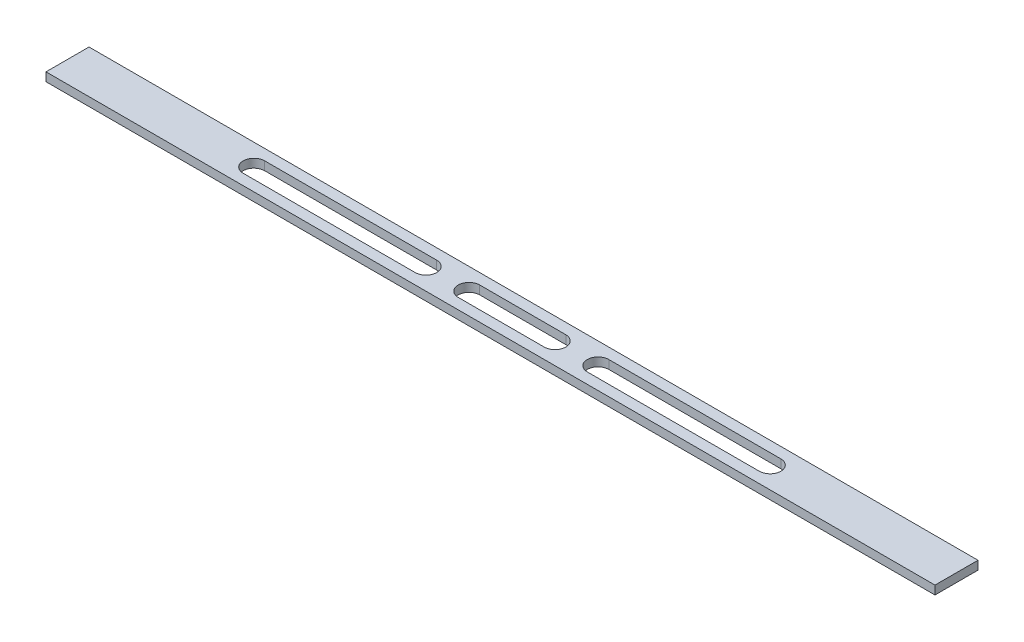
ISO-10303-21;
HEADER;
FILE_DESCRIPTION(('STEP AP214'),'2;1');
FILE_NAME('part.step','',(''),(''),'','','');
FILE_SCHEMA(('AUTOMOTIVE_DESIGN { 1 0 10303 214 1 1 1 1 }'));
ENDSEC;
DATA;
#1=APPLICATION_CONTEXT('core data for automotive mechanical design processes');
#2=APPLICATION_PROTOCOL_DEFINITION('international standard','automotive_design',2000,#1);
#3=PRODUCT_CONTEXT('',#1,'mechanical');
#4=PRODUCT('Part','Part','',(#3));
#5=PRODUCT_RELATED_PRODUCT_CATEGORY('part','',(#4));
#6=PRODUCT_DEFINITION_FORMATION('','',#4);
#7=PRODUCT_DEFINITION_CONTEXT('part definition',#1,'design');
#8=PRODUCT_DEFINITION('design','',#6,#7);
#9=PRODUCT_DEFINITION_SHAPE('','',#8);
#10=(LENGTH_UNIT() NAMED_UNIT(*) SI_UNIT(.MILLI.,.METRE.));
#11=(NAMED_UNIT(*) PLANE_ANGLE_UNIT() SI_UNIT($,.RADIAN.));
#12=(NAMED_UNIT(*) SI_UNIT($,.STERADIAN.) SOLID_ANGLE_UNIT());
#13=UNCERTAINTY_MEASURE_WITH_UNIT(LENGTH_MEASURE(1.E-05),#10,'distance_accuracy_value','');
#14=(GEOMETRIC_REPRESENTATION_CONTEXT(3) GLOBAL_UNCERTAINTY_ASSIGNED_CONTEXT((#13)) GLOBAL_UNIT_ASSIGNED_CONTEXT((#10,
#11,#12)) REPRESENTATION_CONTEXT('',''));
#15=CARTESIAN_POINT('',(0.,0.,0.));
#16=DIRECTION('',(0.,0.,1.));
#17=DIRECTION('',(1.,0.,0.));
#18=AXIS2_PLACEMENT_3D('',#15,#16,#17);
#19=CARTESIAN_POINT('',(-310.,6.,-15.));
#20=DIRECTION('',(1.,0.,0.));
#21=DIRECTION('',(0.,0.,-1.));
#22=AXIS2_PLACEMENT_3D('',#19,#20,#21);
#23=PLANE('',#22);
#24=DIRECTION('',(0.,0.,1.));
#25=VECTOR('',#24,1.);
#26=CARTESIAN_POINT('',(-310.,0.,-15.));
#27=LINE('',#26,#25);
#28=CARTESIAN_POINT('',(-310.,0.,-15.));
#29=VERTEX_POINT('',#28);
#30=CARTESIAN_POINT('',(-310.,0.,15.));
#31=VERTEX_POINT('',#30);
#32=EDGE_CURVE('E241',#29,#31,#27,.T.);
#33=ORIENTED_EDGE('',*,*,#32,.T.);
#34=DIRECTION('',(0.,-1.,0.));
#35=VECTOR('',#34,1.);
#36=CARTESIAN_POINT('',(-310.,6.,15.));
#37=LINE('',#36,#35);
#38=CARTESIAN_POINT('',(-310.,6.,15.));
#39=VERTEX_POINT('',#38);
#40=EDGE_CURVE('E11',#39,#31,#37,.T.);
#41=ORIENTED_EDGE('',*,*,#40,.F.);
#42=DIRECTION('',(0.,0.,1.));
#43=VECTOR('',#42,1.);
#44=CARTESIAN_POINT('',(-310.,6.,-15.));
#45=LINE('',#44,#43);
#46=CARTESIAN_POINT('',(-310.,6.,-15.));
#47=VERTEX_POINT('',#46);
#48=EDGE_CURVE('E248',#47,#39,#45,.T.);
#49=ORIENTED_EDGE('',*,*,#48,.F.);
#50=DIRECTION('',(0.,-1.,0.));
#51=VECTOR('',#50,1.);
#52=CARTESIAN_POINT('',(-310.,6.,-15.));
#53=LINE('',#52,#51);
#54=EDGE_CURVE('E258',#47,#29,#53,.T.);
#55=ORIENTED_EDGE('',*,*,#54,.T.);
#56=EDGE_LOOP('',(#33,#41,#49,#55));
#57=FACE_BOUND('',#56,.T.);
#58=ADVANCED_FACE('F34',(#57),#23,.F.);
#59=CARTESIAN_POINT('',(-310.,6.,15.));
#60=DIRECTION('',(0.,0.,-1.));
#61=DIRECTION('',(-1.,0.,0.));
#62=AXIS2_PLACEMENT_3D('',#59,#60,#61);
#63=PLANE('',#62);
#64=DIRECTION('',(1.,0.,0.));
#65=VECTOR('',#64,1.);
#66=CARTESIAN_POINT('',(-310.,0.,15.));
#67=LINE('',#66,#65);
#68=CARTESIAN_POINT('',(310.,0.,15.));
#69=VERTEX_POINT('',#68);
#70=EDGE_CURVE('E261',#31,#69,#67,.T.);
#71=ORIENTED_EDGE('',*,*,#70,.T.);
#72=DIRECTION('',(0.,-1.,0.));
#73=VECTOR('',#72,1.);
#74=CARTESIAN_POINT('',(310.,6.,15.));
#75=LINE('',#74,#73);
#76=CARTESIAN_POINT('',(310.,6.,15.));
#77=VERTEX_POINT('',#76);
#78=EDGE_CURVE('E41',#77,#69,#75,.T.);
#79=ORIENTED_EDGE('',*,*,#78,.F.);
#80=DIRECTION('',(1.,0.,0.));
#81=VECTOR('',#80,1.);
#82=CARTESIAN_POINT('',(-310.,6.,15.));
#83=LINE('',#82,#81);
#84=EDGE_CURVE('E251',#39,#77,#83,.T.);
#85=ORIENTED_EDGE('',*,*,#84,.F.);
#86=ORIENTED_EDGE('',*,*,#40,.T.);
#87=EDGE_LOOP('',(#71,#79,#85,#86));
#88=FACE_BOUND('',#87,.T.);
#89=ADVANCED_FACE('F290',(#88),#63,.F.);
#90=CARTESIAN_POINT('',(310.,6.,-15.));
#91=DIRECTION('',(-1.,0.,0.));
#92=DIRECTION('',(0.,0.,1.));
#93=AXIS2_PLACEMENT_3D('',#90,#91,#92);
#94=PLANE('',#93);
#95=DIRECTION('',(0.,0.,-1.));
#96=VECTOR('',#95,1.);
#97=CARTESIAN_POINT('',(310.,0.,-15.));
#98=LINE('',#97,#96);
#99=CARTESIAN_POINT('',(310.,0.,-15.));
#100=VERTEX_POINT('',#99);
#101=EDGE_CURVE('E263',#69,#100,#98,.T.);
#102=ORIENTED_EDGE('',*,*,#101,.T.);
#103=DIRECTION('',(0.,-1.,0.));
#104=VECTOR('',#103,1.);
#105=CARTESIAN_POINT('',(310.,6.,-15.));
#106=LINE('',#105,#104);
#107=CARTESIAN_POINT('',(310.,6.,-15.));
#108=VERTEX_POINT('',#107);
#109=EDGE_CURVE('E268',#108,#100,#106,.T.);
#110=ORIENTED_EDGE('',*,*,#109,.F.);
#111=DIRECTION('',(0.,0.,-1.));
#112=VECTOR('',#111,1.);
#113=CARTESIAN_POINT('',(310.,6.,-15.));
#114=LINE('',#113,#112);
#115=EDGE_CURVE('E254',#77,#108,#114,.T.);
#116=ORIENTED_EDGE('',*,*,#115,.F.);
#117=ORIENTED_EDGE('',*,*,#78,.T.);
#118=EDGE_LOOP('',(#102,#110,#116,#117));
#119=FACE_BOUND('',#118,.T.);
#120=ADVANCED_FACE('F275',(#119),#94,.F.);
#121=CARTESIAN_POINT('',(-310.,6.,-15.));
#122=DIRECTION('',(0.,0.,1.));
#123=DIRECTION('',(1.,0.,0.));
#124=AXIS2_PLACEMENT_3D('',#121,#122,#123);
#125=PLANE('',#124);
#126=DIRECTION('',(-1.,0.,0.));
#127=VECTOR('',#126,1.);
#128=CARTESIAN_POINT('',(-310.,0.,-15.));
#129=LINE('',#128,#127);
#130=EDGE_CURVE('E252',#100,#29,#129,.T.);
#131=ORIENTED_EDGE('',*,*,#130,.T.);
#132=ORIENTED_EDGE('',*,*,#54,.F.);
#133=DIRECTION('',(-1.,0.,0.));
#134=VECTOR('',#133,1.);
#135=CARTESIAN_POINT('',(-310.,6.,-15.));
#136=LINE('',#135,#134);
#137=EDGE_CURVE('E256',#108,#47,#136,.T.);
#138=ORIENTED_EDGE('',*,*,#137,.F.);
#139=ORIENTED_EDGE('',*,*,#109,.T.);
#140=EDGE_LOOP('',(#131,#132,#138,#139));
#141=FACE_BOUND('',#140,.T.);
#142=ADVANCED_FACE('F283',(#141),#125,.F.);
#143=CARTESIAN_POINT('',(0.,6.,0.));
#144=DIRECTION('',(0.,1.,0.));
#145=DIRECTION('',(0.,0.,1.));
#146=AXIS2_PLACEMENT_3D('',#143,#144,#145);
#147=PLANE('',#146);
#148=CARTESIAN_POINT('',(60.,6.,0.));
#149=DIRECTION('',(0.,1.,0.));
#150=DIRECTION('',(0.,0.,1.));
#151=AXIS2_PLACEMENT_3D('',#148,#149,#150);
#152=CIRCLE('',#151,7.5);
#153=CARTESIAN_POINT('',(60.,6.,-7.5));
#154=VERTEX_POINT('',#153);
#155=CARTESIAN_POINT('',(60.,6.,7.5));
#156=VERTEX_POINT('',#155);
#157=EDGE_CURVE('E48',#154,#156,#152,.T.);
#158=ORIENTED_EDGE('',*,*,#157,.F.);
#159=DIRECTION('',(-1.,0.,0.));
#160=VECTOR('',#159,1.);
#161=CARTESIAN_POINT('',(60.,6.,-7.5));
#162=LINE('',#161,#160);
#163=CARTESIAN_POINT('',(180.,6.,-7.5));
#164=VERTEX_POINT('',#163);
#165=EDGE_CURVE('E191',#164,#154,#162,.T.);
#166=ORIENTED_EDGE('',*,*,#165,.F.);
#167=CARTESIAN_POINT('',(180.,6.,0.));
#168=DIRECTION('',(0.,1.,0.));
#169=DIRECTION('',(0.,0.,1.));
#170=AXIS2_PLACEMENT_3D('',#167,#168,#169);
#171=CIRCLE('',#170,7.5);
#172=CARTESIAN_POINT('',(180.,6.,7.5));
#173=VERTEX_POINT('',#172);
#174=EDGE_CURVE('E205',#173,#164,#171,.T.);
#175=ORIENTED_EDGE('',*,*,#174,.F.);
#176=DIRECTION('',(1.,0.,0.));
#177=VECTOR('',#176,1.);
#178=CARTESIAN_POINT('',(60.,6.,7.5));
#179=LINE('',#178,#177);
#180=EDGE_CURVE('E202',#156,#173,#179,.T.);
#181=ORIENTED_EDGE('',*,*,#180,.F.);
#182=EDGE_LOOP('',(#158,#166,#175,#181));
#183=FACE_BOUND('',#182,.T.);
#184=CARTESIAN_POINT('',(-60.,6.,0.));
#185=DIRECTION('',(0.,1.,0.));
#186=DIRECTION('',(0.,0.,1.));
#187=AXIS2_PLACEMENT_3D('',#184,#185,#186);
#188=CIRCLE('',#187,7.5);
#189=CARTESIAN_POINT('',(-60.,6.,7.50000000000001));
#190=VERTEX_POINT('',#189);
#191=CARTESIAN_POINT('',(-60.,6.,-7.49999999999999));
#192=VERTEX_POINT('',#191);
#193=EDGE_CURVE('E56',#190,#192,#188,.T.);
#194=ORIENTED_EDGE('',*,*,#193,.F.);
#195=DIRECTION('',(1.,0.,0.));
#196=VECTOR('',#195,1.);
#197=CARTESIAN_POINT('',(-60.,6.,7.50000000000001));
#198=LINE('',#197,#196);
#199=CARTESIAN_POINT('',(-180.,6.,7.50000000000003));
#200=VERTEX_POINT('',#199);
#201=EDGE_CURVE('E167',#200,#190,#198,.T.);
#202=ORIENTED_EDGE('',*,*,#201,.F.);
#203=CARTESIAN_POINT('',(-180.,6.,0.));
#204=DIRECTION('',(0.,1.,0.));
#205=DIRECTION('',(0.,0.,1.));
#206=AXIS2_PLACEMENT_3D('',#203,#204,#205);
#207=CIRCLE('',#206,7.5);
#208=CARTESIAN_POINT('',(-180.,6.,-7.49999999999997));
#209=VERTEX_POINT('',#208);
#210=EDGE_CURVE('E170',#209,#200,#207,.T.);
#211=ORIENTED_EDGE('',*,*,#210,.F.);
#212=DIRECTION('',(-1.,0.,0.));
#213=VECTOR('',#212,1.);
#214=CARTESIAN_POINT('',(-60.,6.,-7.49999999999999));
#215=LINE('',#214,#213);
#216=EDGE_CURVE('E176',#192,#209,#215,.T.);
#217=ORIENTED_EDGE('',*,*,#216,.F.);
#218=EDGE_LOOP('',(#194,#202,#211,#217));
#219=FACE_BOUND('',#218,.T.);
#220=CARTESIAN_POINT('',(30.,6.,0.));
#221=DIRECTION('',(0.,1.,0.));
#222=DIRECTION('',(0.,0.,1.));
#223=AXIS2_PLACEMENT_3D('',#220,#221,#222);
#224=CIRCLE('',#223,7.5);
#225=CARTESIAN_POINT('',(30.,6.,7.50000000000001));
#226=VERTEX_POINT('',#225);
#227=CARTESIAN_POINT('',(30.,6.,-7.49999999999999));
#228=VERTEX_POINT('',#227);
#229=EDGE_CURVE('E183',#226,#228,#224,.T.);
#230=ORIENTED_EDGE('',*,*,#229,.F.);
#231=DIRECTION('',(1.,0.,0.));
#232=VECTOR('',#231,1.);
#233=CARTESIAN_POINT('',(30.,6.,7.50000000000001));
#234=LINE('',#233,#232);
#235=CARTESIAN_POINT('',(-30.,6.,7.50000000000001));
#236=VERTEX_POINT('',#235);
#237=EDGE_CURVE('E220',#236,#226,#234,.T.);
#238=ORIENTED_EDGE('',*,*,#237,.F.);
#239=CARTESIAN_POINT('',(-30.,6.,0.));
#240=DIRECTION('',(0.,1.,0.));
#241=DIRECTION('',(0.,0.,1.));
#242=AXIS2_PLACEMENT_3D('',#239,#240,#241);
#243=CIRCLE('',#242,7.5);
#244=CARTESIAN_POINT('',(-30.,6.,-7.49999999999999));
#245=VERTEX_POINT('',#244);
#246=EDGE_CURVE('E234',#245,#236,#243,.T.);
#247=ORIENTED_EDGE('',*,*,#246,.F.);
#248=DIRECTION('',(-1.,0.,0.));
#249=VECTOR('',#248,1.);
#250=CARTESIAN_POINT('',(30.,6.,-7.49999999999999));
#251=LINE('',#250,#249);
#252=EDGE_CURVE('E231',#228,#245,#251,.T.);
#253=ORIENTED_EDGE('',*,*,#252,.F.);
#254=EDGE_LOOP('',(#230,#238,#247,#253));
#255=FACE_BOUND('',#254,.T.);
#256=ORIENTED_EDGE('',*,*,#48,.T.);
#257=ORIENTED_EDGE('',*,*,#84,.T.);
#258=ORIENTED_EDGE('',*,*,#115,.T.);
#259=ORIENTED_EDGE('',*,*,#137,.T.);
#260=EDGE_LOOP('',(#256,#257,#258,#259));
#261=FACE_BOUND('',#260,.T.);
#262=ADVANCED_FACE('F289',(#183,#219,#255,#261),#147,.T.);
#263=CARTESIAN_POINT('',(0.,0.,0.));
#264=DIRECTION('',(0.,1.,0.));
#265=DIRECTION('',(0.,0.,1.));
#266=AXIS2_PLACEMENT_3D('',#263,#264,#265);
#267=PLANE('',#266);
#268=DIRECTION('',(-1.,0.,0.));
#269=VECTOR('',#268,1.);
#270=CARTESIAN_POINT('',(60.,0.,-7.5));
#271=LINE('',#270,#269);
#272=CARTESIAN_POINT('',(180.,0.,-7.5));
#273=VERTEX_POINT('',#272);
#274=CARTESIAN_POINT('',(60.,0.,-7.5));
#275=VERTEX_POINT('',#274);
#276=EDGE_CURVE('E197',#273,#275,#271,.T.);
#277=ORIENTED_EDGE('',*,*,#276,.T.);
#278=CARTESIAN_POINT('',(60.,0.,0.));
#279=DIRECTION('',(0.,1.,0.));
#280=DIRECTION('',(0.,0.,1.));
#281=AXIS2_PLACEMENT_3D('',#278,#279,#280);
#282=CIRCLE('',#281,7.5);
#283=CARTESIAN_POINT('',(60.,0.,7.5));
#284=VERTEX_POINT('',#283);
#285=EDGE_CURVE('E187',#275,#284,#282,.T.);
#286=ORIENTED_EDGE('',*,*,#285,.T.);
#287=DIRECTION('',(1.,0.,0.));
#288=VECTOR('',#287,1.);
#289=CARTESIAN_POINT('',(60.,0.,7.5));
#290=LINE('',#289,#288);
#291=CARTESIAN_POINT('',(180.,0.,7.5));
#292=VERTEX_POINT('',#291);
#293=EDGE_CURVE('E190',#284,#292,#290,.T.);
#294=ORIENTED_EDGE('',*,*,#293,.T.);
#295=CARTESIAN_POINT('',(180.,0.,0.));
#296=DIRECTION('',(0.,1.,0.));
#297=DIRECTION('',(0.,0.,1.));
#298=AXIS2_PLACEMENT_3D('',#295,#296,#297);
#299=CIRCLE('',#298,7.5);
#300=EDGE_CURVE('E194',#292,#273,#299,.T.);
#301=ORIENTED_EDGE('',*,*,#300,.T.);
#302=EDGE_LOOP('',(#277,#286,#294,#301));
#303=FACE_BOUND('',#302,.T.);
#304=DIRECTION('',(1.,0.,0.));
#305=VECTOR('',#304,1.);
#306=CARTESIAN_POINT('',(-60.,0.,7.50000000000001));
#307=LINE('',#306,#305);
#308=CARTESIAN_POINT('',(-180.,0.,7.50000000000003));
#309=VERTEX_POINT('',#308);
#310=CARTESIAN_POINT('',(-60.,0.,7.50000000000001));
#311=VERTEX_POINT('',#310);
#312=EDGE_CURVE('E154',#309,#311,#307,.T.);
#313=ORIENTED_EDGE('',*,*,#312,.T.);
#314=CARTESIAN_POINT('',(-60.,0.,0.));
#315=DIRECTION('',(0.,1.,0.));
#316=DIRECTION('',(0.,0.,1.));
#317=AXIS2_PLACEMENT_3D('',#314,#315,#316);
#318=CIRCLE('',#317,7.5);
#319=CARTESIAN_POINT('',(-60.,0.,-7.49999999999999));
#320=VERTEX_POINT('',#319);
#321=EDGE_CURVE('E148',#311,#320,#318,.T.);
#322=ORIENTED_EDGE('',*,*,#321,.T.);
#323=DIRECTION('',(-1.,0.,0.));
#324=VECTOR('',#323,1.);
#325=CARTESIAN_POINT('',(-60.,0.,-7.49999999999999));
#326=LINE('',#325,#324);
#327=CARTESIAN_POINT('',(-180.,0.,-7.49999999999997));
#328=VERTEX_POINT('',#327);
#329=EDGE_CURVE('E158',#320,#328,#326,.T.);
#330=ORIENTED_EDGE('',*,*,#329,.T.);
#331=CARTESIAN_POINT('',(-180.,0.,0.));
#332=DIRECTION('',(0.,1.,0.));
#333=DIRECTION('',(0.,0.,1.));
#334=AXIS2_PLACEMENT_3D('',#331,#332,#333);
#335=CIRCLE('',#334,7.5);
#336=EDGE_CURVE('E162',#328,#309,#335,.T.);
#337=ORIENTED_EDGE('',*,*,#336,.T.);
#338=EDGE_LOOP('',(#313,#322,#330,#337));
#339=FACE_BOUND('',#338,.T.);
#340=DIRECTION('',(1.,0.,0.));
#341=VECTOR('',#340,1.);
#342=CARTESIAN_POINT('',(30.,0.,7.50000000000001));
#343=LINE('',#342,#341);
#344=CARTESIAN_POINT('',(-30.,0.,7.50000000000001));
#345=VERTEX_POINT('',#344);
#346=CARTESIAN_POINT('',(30.,0.,7.50000000000001));
#347=VERTEX_POINT('',#346);
#348=EDGE_CURVE('E226',#345,#347,#343,.T.);
#349=ORIENTED_EDGE('',*,*,#348,.T.);
#350=CARTESIAN_POINT('',(30.,0.,0.));
#351=DIRECTION('',(0.,1.,0.));
#352=DIRECTION('',(0.,0.,1.));
#353=AXIS2_PLACEMENT_3D('',#350,#351,#352);
#354=CIRCLE('',#353,7.5);
#355=CARTESIAN_POINT('',(30.,0.,-7.49999999999999));
#356=VERTEX_POINT('',#355);
#357=EDGE_CURVE('E216',#347,#356,#354,.T.);
#358=ORIENTED_EDGE('',*,*,#357,.T.);
#359=DIRECTION('',(-1.,0.,0.));
#360=VECTOR('',#359,1.);
#361=CARTESIAN_POINT('',(30.,0.,-7.49999999999999));
#362=LINE('',#361,#360);
#363=CARTESIAN_POINT('',(-30.,0.,-7.49999999999999));
#364=VERTEX_POINT('',#363);
#365=EDGE_CURVE('E219',#356,#364,#362,.T.);
#366=ORIENTED_EDGE('',*,*,#365,.T.);
#367=CARTESIAN_POINT('',(-30.,0.,0.));
#368=DIRECTION('',(0.,1.,0.));
#369=DIRECTION('',(0.,0.,1.));
#370=AXIS2_PLACEMENT_3D('',#367,#368,#369);
#371=CIRCLE('',#370,7.5);
#372=EDGE_CURVE('E223',#364,#345,#371,.T.);
#373=ORIENTED_EDGE('',*,*,#372,.T.);
#374=EDGE_LOOP('',(#349,#358,#366,#373));
#375=FACE_BOUND('',#374,.T.);
#376=ORIENTED_EDGE('',*,*,#32,.F.);
#377=ORIENTED_EDGE('',*,*,#130,.F.);
#378=ORIENTED_EDGE('',*,*,#101,.F.);
#379=ORIENTED_EDGE('',*,*,#70,.F.);
#380=EDGE_LOOP('',(#376,#377,#378,#379));
#381=FACE_BOUND('',#380,.T.);
#382=ADVANCED_FACE('F164',(#303,#339,#375,#381),#267,.F.);
#383=CARTESIAN_POINT('',(30.,0.,0.));
#384=DIRECTION('',(0.,1.,0.));
#385=DIRECTION('',(0.,0.,1.));
#386=AXIS2_PLACEMENT_3D('',#383,#384,#385);
#387=CYLINDRICAL_SURFACE('',#386,7.5);
#388=ORIENTED_EDGE('',*,*,#229,.T.);
#389=DIRECTION('',(0.,1.,0.));
#390=VECTOR('',#389,1.);
#391=CARTESIAN_POINT('',(30.,0.,-7.49999999999999));
#392=LINE('',#391,#390);
#393=EDGE_CURVE('E229',#356,#228,#392,.T.);
#394=ORIENTED_EDGE('',*,*,#393,.F.);
#395=ORIENTED_EDGE('',*,*,#357,.F.);
#396=DIRECTION('',(0.,1.,0.));
#397=VECTOR('',#396,1.);
#398=CARTESIAN_POINT('',(30.,0.,7.50000000000001));
#399=LINE('',#398,#397);
#400=EDGE_CURVE('E239',#347,#226,#399,.T.);
#401=ORIENTED_EDGE('',*,*,#400,.T.);
#402=EDGE_LOOP('',(#388,#394,#395,#401));
#403=FACE_BOUND('',#402,.T.);
#404=ADVANCED_FACE('F302',(#403),#387,.F.);
#405=CARTESIAN_POINT('',(30.,0.,7.50000000000001));
#406=DIRECTION('',(0.,0.,1.));
#407=DIRECTION('',(1.,0.,0.));
#408=AXIS2_PLACEMENT_3D('',#405,#406,#407);
#409=PLANE('',#408);
#410=ORIENTED_EDGE('',*,*,#237,.T.);
#411=ORIENTED_EDGE('',*,*,#400,.F.);
#412=ORIENTED_EDGE('',*,*,#348,.F.);
#413=DIRECTION('',(0.,1.,0.));
#414=VECTOR('',#413,1.);
#415=CARTESIAN_POINT('',(-30.,0.,7.50000000000001));
#416=LINE('',#415,#414);
#417=EDGE_CURVE('E242',#345,#236,#416,.T.);
#418=ORIENTED_EDGE('',*,*,#417,.T.);
#419=EDGE_LOOP('',(#410,#411,#412,#418));
#420=FACE_BOUND('',#419,.T.);
#421=ADVANCED_FACE('F309',(#420),#409,.F.);
#422=CARTESIAN_POINT('',(-30.,0.,0.));
#423=DIRECTION('',(0.,1.,0.));
#424=DIRECTION('',(0.,0.,1.));
#425=AXIS2_PLACEMENT_3D('',#422,#423,#424);
#426=CYLINDRICAL_SURFACE('',#425,7.5);
#427=ORIENTED_EDGE('',*,*,#246,.T.);
#428=ORIENTED_EDGE('',*,*,#417,.F.);
#429=ORIENTED_EDGE('',*,*,#372,.F.);
#430=DIRECTION('',(0.,1.,0.));
#431=VECTOR('',#430,1.);
#432=CARTESIAN_POINT('',(-30.,0.,-7.49999999999999));
#433=LINE('',#432,#431);
#434=EDGE_CURVE('E244',#364,#245,#433,.T.);
#435=ORIENTED_EDGE('',*,*,#434,.T.);
#436=EDGE_LOOP('',(#427,#428,#429,#435));
#437=FACE_BOUND('',#436,.T.);
#438=ADVANCED_FACE('F314',(#437),#426,.F.);
#439=CARTESIAN_POINT('',(30.,0.,-7.49999999999999));
#440=DIRECTION('',(0.,0.,-1.));
#441=DIRECTION('',(-1.,0.,0.));
#442=AXIS2_PLACEMENT_3D('',#439,#440,#441);
#443=PLANE('',#442);
#444=ORIENTED_EDGE('',*,*,#252,.T.);
#445=ORIENTED_EDGE('',*,*,#434,.F.);
#446=ORIENTED_EDGE('',*,*,#365,.F.);
#447=ORIENTED_EDGE('',*,*,#393,.T.);
#448=EDGE_LOOP('',(#444,#445,#446,#447));
#449=FACE_BOUND('',#448,.T.);
#450=ADVANCED_FACE('F311',(#449),#443,.F.);
#451=CARTESIAN_POINT('',(-60.,0.,0.));
#452=DIRECTION('',(0.,1.,0.));
#453=DIRECTION('',(0.,0.,1.));
#454=AXIS2_PLACEMENT_3D('',#451,#452,#453);
#455=CYLINDRICAL_SURFACE('',#454,7.5);
#456=ORIENTED_EDGE('',*,*,#193,.T.);
#457=DIRECTION('',(0.,1.,0.));
#458=VECTOR('',#457,1.);
#459=CARTESIAN_POINT('',(-60.,0.,-7.49999999999999));
#460=LINE('',#459,#458);
#461=EDGE_CURVE('E144',#320,#192,#460,.T.);
#462=ORIENTED_EDGE('',*,*,#461,.F.);
#463=ORIENTED_EDGE('',*,*,#321,.F.);
#464=DIRECTION('',(0.,1.,0.));
#465=VECTOR('',#464,1.);
#466=CARTESIAN_POINT('',(-60.,0.,7.50000000000001));
#467=LINE('',#466,#465);
#468=EDGE_CURVE('E181',#311,#190,#467,.T.);
#469=ORIENTED_EDGE('',*,*,#468,.T.);
#470=EDGE_LOOP('',(#456,#462,#463,#469));
#471=FACE_BOUND('',#470,.T.);
#472=ADVANCED_FACE('F146',(#471),#455,.F.);
#473=CARTESIAN_POINT('',(-60.,0.,7.50000000000001));
#474=DIRECTION('',(0.,0.,1.));
#475=DIRECTION('',(1.,0.,0.));
#476=AXIS2_PLACEMENT_3D('',#473,#474,#475);
#477=PLANE('',#476);
#478=ORIENTED_EDGE('',*,*,#201,.T.);
#479=ORIENTED_EDGE('',*,*,#468,.F.);
#480=ORIENTED_EDGE('',*,*,#312,.F.);
#481=DIRECTION('',(0.,1.,0.));
#482=VECTOR('',#481,1.);
#483=CARTESIAN_POINT('',(-180.,0.,7.50000000000003));
#484=LINE('',#483,#482);
#485=EDGE_CURVE('E184',#309,#200,#484,.T.);
#486=ORIENTED_EDGE('',*,*,#485,.T.);
#487=EDGE_LOOP('',(#478,#479,#480,#486));
#488=FACE_BOUND('',#487,.T.);
#489=ADVANCED_FACE('F339',(#488),#477,.F.);
#490=CARTESIAN_POINT('',(-180.,0.,0.));
#491=DIRECTION('',(0.,1.,0.));
#492=DIRECTION('',(0.,0.,1.));
#493=AXIS2_PLACEMENT_3D('',#490,#491,#492);
#494=CYLINDRICAL_SURFACE('',#493,7.5);
#495=ORIENTED_EDGE('',*,*,#210,.T.);
#496=ORIENTED_EDGE('',*,*,#485,.F.);
#497=ORIENTED_EDGE('',*,*,#336,.F.);
#498=DIRECTION('',(0.,1.,0.));
#499=VECTOR('',#498,1.);
#500=CARTESIAN_POINT('',(-180.,0.,-7.49999999999997));
#501=LINE('',#500,#499);
#502=EDGE_CURVE('E153',#328,#209,#501,.T.);
#503=ORIENTED_EDGE('',*,*,#502,.T.);
#504=EDGE_LOOP('',(#495,#496,#497,#503));
#505=FACE_BOUND('',#504,.T.);
#506=ADVANCED_FACE('F342',(#505),#494,.F.);
#507=CARTESIAN_POINT('',(-60.,0.,-7.49999999999999));
#508=DIRECTION('',(0.,0.,-1.));
#509=DIRECTION('',(-1.,0.,0.));
#510=AXIS2_PLACEMENT_3D('',#507,#508,#509);
#511=PLANE('',#510);
#512=ORIENTED_EDGE('',*,*,#216,.T.);
#513=ORIENTED_EDGE('',*,*,#502,.F.);
#514=ORIENTED_EDGE('',*,*,#329,.F.);
#515=ORIENTED_EDGE('',*,*,#461,.T.);
#516=EDGE_LOOP('',(#512,#513,#514,#515));
#517=FACE_BOUND('',#516,.T.);
#518=ADVANCED_FACE('F159',(#517),#511,.F.);
#519=CARTESIAN_POINT('',(60.,0.,0.));
#520=DIRECTION('',(0.,1.,0.));
#521=DIRECTION('',(0.,0.,1.));
#522=AXIS2_PLACEMENT_3D('',#519,#520,#521);
#523=CYLINDRICAL_SURFACE('',#522,7.5);
#524=ORIENTED_EDGE('',*,*,#157,.T.);
#525=DIRECTION('',(0.,1.,0.));
#526=VECTOR('',#525,1.);
#527=CARTESIAN_POINT('',(60.,0.,7.5));
#528=LINE('',#527,#526);
#529=EDGE_CURVE('E200',#284,#156,#528,.T.);
#530=ORIENTED_EDGE('',*,*,#529,.F.);
#531=ORIENTED_EDGE('',*,*,#285,.F.);
#532=DIRECTION('',(0.,1.,0.));
#533=VECTOR('',#532,1.);
#534=CARTESIAN_POINT('',(60.,0.,-7.5));
#535=LINE('',#534,#533);
#536=EDGE_CURVE('E177',#275,#154,#535,.T.);
#537=ORIENTED_EDGE('',*,*,#536,.T.);
#538=EDGE_LOOP('',(#524,#530,#531,#537));
#539=FACE_BOUND('',#538,.T.);
#540=ADVANCED_FACE('F322',(#539),#523,.F.);
#541=CARTESIAN_POINT('',(60.,0.,-7.5));
#542=DIRECTION('',(0.,0.,-1.));
#543=DIRECTION('',(-1.,0.,0.));
#544=AXIS2_PLACEMENT_3D('',#541,#542,#543);
#545=PLANE('',#544);
#546=ORIENTED_EDGE('',*,*,#165,.T.);
#547=ORIENTED_EDGE('',*,*,#536,.F.);
#548=ORIENTED_EDGE('',*,*,#276,.F.);
#549=DIRECTION('',(0.,1.,0.));
#550=VECTOR('',#549,1.);
#551=CARTESIAN_POINT('',(180.,0.,-7.5));
#552=LINE('',#551,#550);
#553=EDGE_CURVE('E211',#273,#164,#552,.T.);
#554=ORIENTED_EDGE('',*,*,#553,.T.);
#555=EDGE_LOOP('',(#546,#547,#548,#554));
#556=FACE_BOUND('',#555,.T.);
#557=ADVANCED_FACE('F325',(#556),#545,.F.);
#558=CARTESIAN_POINT('',(180.,0.,0.));
#559=DIRECTION('',(0.,1.,0.));
#560=DIRECTION('',(0.,0.,1.));
#561=AXIS2_PLACEMENT_3D('',#558,#559,#560);
#562=CYLINDRICAL_SURFACE('',#561,7.5);
#563=ORIENTED_EDGE('',*,*,#174,.T.);
#564=ORIENTED_EDGE('',*,*,#553,.F.);
#565=ORIENTED_EDGE('',*,*,#300,.F.);
#566=DIRECTION('',(0.,1.,0.));
#567=VECTOR('',#566,1.);
#568=CARTESIAN_POINT('',(180.,0.,7.5));
#569=LINE('',#568,#567);
#570=EDGE_CURVE('E213',#292,#173,#569,.T.);
#571=ORIENTED_EDGE('',*,*,#570,.T.);
#572=EDGE_LOOP('',(#563,#564,#565,#571));
#573=FACE_BOUND('',#572,.T.);
#574=ADVANCED_FACE('F329',(#573),#562,.F.);
#575=CARTESIAN_POINT('',(60.,0.,7.5));
#576=DIRECTION('',(0.,0.,1.));
#577=DIRECTION('',(1.,0.,0.));
#578=AXIS2_PLACEMENT_3D('',#575,#576,#577);
#579=PLANE('',#578);
#580=ORIENTED_EDGE('',*,*,#180,.T.);
#581=ORIENTED_EDGE('',*,*,#570,.F.);
#582=ORIENTED_EDGE('',*,*,#293,.F.);
#583=ORIENTED_EDGE('',*,*,#529,.T.);
#584=EDGE_LOOP('',(#580,#581,#582,#583));
#585=FACE_BOUND('',#584,.T.);
#586=ADVANCED_FACE('F326',(#585),#579,.F.);
#587=CLOSED_SHELL('',(#58,#89,#120,#142,#262,#382,#404,#421,#438,#450,#472,#489,#506,#518,#540,
#557,#574,#586));
#588=MANIFOLD_SOLID_BREP('B2',#587);
#589=ADVANCED_BREP_SHAPE_REPRESENTATION('',(#18,#588),#14);
#590=SHAPE_DEFINITION_REPRESENTATION(#9,#589);
ENDSEC;
END-ISO-10303-21;
